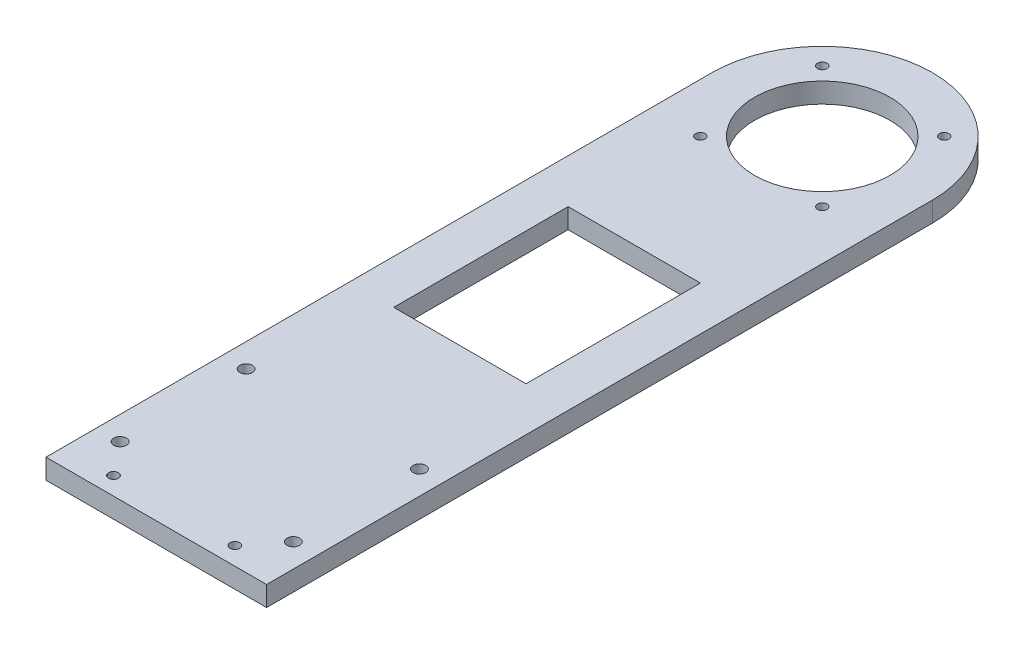
ISO-10303-21;
HEADER;
FILE_DESCRIPTION(('STEP AP214'),'2;1');
FILE_NAME('part.step','',(''),(''),'','','');
FILE_SCHEMA(('AUTOMOTIVE_DESIGN { 1 0 10303 214 1 1 1 1 }'));
ENDSEC;
DATA;
#1=APPLICATION_CONTEXT('core data for automotive mechanical design processes');
#2=APPLICATION_PROTOCOL_DEFINITION('international standard','automotive_design',2000,#1);
#3=PRODUCT_CONTEXT('',#1,'mechanical');
#4=PRODUCT('Part','Part','',(#3));
#5=PRODUCT_RELATED_PRODUCT_CATEGORY('part','',(#4));
#6=PRODUCT_DEFINITION_FORMATION('','',#4);
#7=PRODUCT_DEFINITION_CONTEXT('part definition',#1,'design');
#8=PRODUCT_DEFINITION('design','',#6,#7);
#9=PRODUCT_DEFINITION_SHAPE('','',#8);
#10=(LENGTH_UNIT() NAMED_UNIT(*) SI_UNIT(.MILLI.,.METRE.));
#11=(NAMED_UNIT(*) PLANE_ANGLE_UNIT() SI_UNIT($,.RADIAN.));
#12=(NAMED_UNIT(*) SI_UNIT($,.STERADIAN.) SOLID_ANGLE_UNIT());
#13=UNCERTAINTY_MEASURE_WITH_UNIT(LENGTH_MEASURE(1.E-05),#10,'distance_accuracy_value','');
#14=(GEOMETRIC_REPRESENTATION_CONTEXT(3) GLOBAL_UNCERTAINTY_ASSIGNED_CONTEXT((#13)) GLOBAL_UNIT_ASSIGNED_CONTEXT((#10,
#11,#12)) REPRESENTATION_CONTEXT('',''));
#15=CARTESIAN_POINT('',(0.,0.,0.));
#16=DIRECTION('',(0.,0.,1.));
#17=DIRECTION('',(1.,0.,0.));
#18=AXIS2_PLACEMENT_3D('',#15,#16,#17);
#19=CARTESIAN_POINT('',(0.,3.175,0.));
#20=DIRECTION('',(0.,1.,0.));
#21=DIRECTION('',(0.,0.,1.));
#22=AXIS2_PLACEMENT_3D('',#19,#20,#21);
#23=PLANE('',#22);
#24=CARTESIAN_POINT('',(-19.25,3.175,205.675));
#25=DIRECTION('',(0.,1.,0.));
#26=DIRECTION('',(0.,0.,1.));
#27=AXIS2_PLACEMENT_3D('',#24,#25,#26);
#28=CIRCLE('',#27,1.55);
#29=CARTESIAN_POINT('',(-19.25,3.175,207.225));
#30=VERTEX_POINT('',#29);
#31=EDGE_CURVE('E174',#30,#30,#28,.T.);
#32=ORIENTED_EDGE('',*,*,#31,.F.);
#33=EDGE_LOOP('',(#32));
#34=FACE_BOUND('',#33,.T.);
#35=CARTESIAN_POINT('',(19.25,3.175,205.675));
#36=DIRECTION('',(0.,1.,0.));
#37=DIRECTION('',(0.,0.,1.));
#38=AXIS2_PLACEMENT_3D('',#35,#36,#37);
#39=CIRCLE('',#38,1.55);
#40=CARTESIAN_POINT('',(19.25,3.175,207.225));
#41=VERTEX_POINT('',#40);
#42=EDGE_CURVE('E180',#41,#41,#39,.T.);
#43=ORIENTED_EDGE('',*,*,#42,.F.);
#44=EDGE_LOOP('',(#43));
#45=FACE_BOUND('',#44,.T.);
#46=CARTESIAN_POINT('',(27.5,3.175,155.350000000001));
#47=DIRECTION('',(0.,1.,0.));
#48=DIRECTION('',(0.,0.,-1.));
#49=AXIS2_PLACEMENT_3D('',#46,#47,#48);
#50=CIRCLE('',#49,2.00000000000001);
#51=CARTESIAN_POINT('',(27.5,3.175,153.350000000001));
#52=VERTEX_POINT('',#51);
#53=EDGE_CURVE('E190',#52,#52,#50,.T.);
#54=ORIENTED_EDGE('',*,*,#53,.F.);
#55=EDGE_LOOP('',(#54));
#56=FACE_BOUND('',#55,.T.);
#57=CARTESIAN_POINT('',(-27.5,3.175,195.350000000001));
#58=DIRECTION('',(0.,1.,0.));
#59=DIRECTION('',(0.,0.,1.));
#60=AXIS2_PLACEMENT_3D('',#57,#58,#59);
#61=CIRCLE('',#60,2.00000000000001);
#62=CARTESIAN_POINT('',(-27.5,3.175,197.350000000001));
#63=VERTEX_POINT('',#62);
#64=EDGE_CURVE('E197',#63,#63,#61,.T.);
#65=ORIENTED_EDGE('',*,*,#64,.F.);
#66=EDGE_LOOP('',(#65));
#67=FACE_BOUND('',#66,.T.);
#68=CARTESIAN_POINT('',(27.5,3.175,195.350000000001));
#69=DIRECTION('',(0.,1.,0.));
#70=DIRECTION('',(0.,0.,1.));
#71=AXIS2_PLACEMENT_3D('',#68,#69,#70);
#72=CIRCLE('',#71,2.00000000000001);
#73=CARTESIAN_POINT('',(27.5,3.175,197.350000000001));
#74=VERTEX_POINT('',#73);
#75=EDGE_CURVE('E196',#74,#74,#72,.T.);
#76=ORIENTED_EDGE('',*,*,#75,.F.);
#77=EDGE_LOOP('',(#76));
#78=FACE_BOUND('',#77,.T.);
#79=CARTESIAN_POINT('',(-27.5,3.175,155.350000000001));
#80=DIRECTION('',(0.,1.,0.));
#81=DIRECTION('',(0.,0.,-1.));
#82=AXIS2_PLACEMENT_3D('',#79,#80,#81);
#83=CIRCLE('',#82,2.00000000000001);
#84=CARTESIAN_POINT('',(-27.5,3.175,153.350000000001));
#85=VERTEX_POINT('',#84);
#86=EDGE_CURVE('E178',#85,#85,#83,.T.);
#87=ORIENTED_EDGE('',*,*,#86,.F.);
#88=EDGE_LOOP('',(#87));
#89=FACE_BOUND('',#88,.T.);
#90=CARTESIAN_POINT('',(-19.35,3.175,-19.35));
#91=DIRECTION('',(0.,-1.,0.));
#92=DIRECTION('',(0.,0.,-1.));
#93=AXIS2_PLACEMENT_3D('',#90,#91,#92);
#94=CIRCLE('',#93,1.5);
#95=CARTESIAN_POINT('',(-19.35,3.175,-20.85));
#96=VERTEX_POINT('',#95);
#97=EDGE_CURVE('E223',#96,#96,#94,.T.);
#98=ORIENTED_EDGE('',*,*,#97,.T.);
#99=EDGE_LOOP('',(#98));
#100=FACE_BOUND('',#99,.T.);
#101=CARTESIAN_POINT('',(19.35,3.175,-19.35));
#102=DIRECTION('',(0.,-1.,0.));
#103=DIRECTION('',(0.,0.,-1.));
#104=AXIS2_PLACEMENT_3D('',#101,#102,#103);
#105=CIRCLE('',#104,1.5);
#106=CARTESIAN_POINT('',(19.35,3.175,-20.85));
#107=VERTEX_POINT('',#106);
#108=EDGE_CURVE('E217',#107,#107,#105,.T.);
#109=ORIENTED_EDGE('',*,*,#108,.T.);
#110=EDGE_LOOP('',(#109));
#111=FACE_BOUND('',#110,.T.);
#112=CARTESIAN_POINT('',(19.35,3.175,19.35));
#113=DIRECTION('',(0.,-1.,0.));
#114=DIRECTION('',(0.,0.,-1.));
#115=AXIS2_PLACEMENT_3D('',#112,#113,#114);
#116=CIRCLE('',#115,1.5);
#117=CARTESIAN_POINT('',(19.35,3.175,17.85));
#118=VERTEX_POINT('',#117);
#119=EDGE_CURVE('E211',#118,#118,#116,.T.);
#120=ORIENTED_EDGE('',*,*,#119,.T.);
#121=EDGE_LOOP('',(#120));
#122=FACE_BOUND('',#121,.T.);
#123=CARTESIAN_POINT('',(-19.35,3.175,19.35));
#124=DIRECTION('',(0.,-1.,0.));
#125=DIRECTION('',(0.,0.,-1.));
#126=AXIS2_PLACEMENT_3D('',#123,#124,#125);
#127=CIRCLE('',#126,1.5);
#128=CARTESIAN_POINT('',(-19.35,3.175,17.85));
#129=VERTEX_POINT('',#128);
#130=EDGE_CURVE('E132',#129,#129,#127,.T.);
#131=ORIENTED_EDGE('',*,*,#130,.T.);
#132=EDGE_LOOP('',(#131));
#133=FACE_BOUND('',#132,.T.);
#134=CARTESIAN_POINT('',(0.,3.175,0.));
#135=DIRECTION('',(0.,1.,0.));
#136=DIRECTION('',(0.,0.,1.));
#137=AXIS2_PLACEMENT_3D('',#134,#135,#136);
#138=CIRCLE('',#137,21.5);
#139=CARTESIAN_POINT('',(0.,3.175,21.5));
#140=VERTEX_POINT('',#139);
#141=EDGE_CURVE('E138',#140,#140,#138,.T.);
#142=ORIENTED_EDGE('',*,*,#141,.F.);
#143=EDGE_LOOP('',(#142));
#144=FACE_BOUND('',#143,.T.);
#145=CARTESIAN_POINT('',(0.,3.175,0.));
#146=DIRECTION('',(0.,1.,0.));
#147=DIRECTION('',(0.,0.,1.));
#148=AXIS2_PLACEMENT_3D('',#145,#146,#147);
#149=CIRCLE('',#148,35.);
#150=CARTESIAN_POINT('',(35.,3.175,0.));
#151=VERTEX_POINT('',#150);
#152=CARTESIAN_POINT('',(-35.,3.175,0.));
#153=VERTEX_POINT('',#152);
#154=EDGE_CURVE('E148',#151,#153,#149,.T.);
#155=ORIENTED_EDGE('',*,*,#154,.T.);
#156=DIRECTION('',(0.,0.,1.));
#157=VECTOR('',#156,1.);
#158=CARTESIAN_POINT('',(-35.,3.175,0.));
#159=LINE('',#158,#157);
#160=CARTESIAN_POINT('',(-35.,3.175,211.35));
#161=VERTEX_POINT('',#160);
#162=EDGE_CURVE('E151',#153,#161,#159,.T.);
#163=ORIENTED_EDGE('',*,*,#162,.T.);
#164=DIRECTION('',(1.,0.,0.));
#165=VECTOR('',#164,1.);
#166=CARTESIAN_POINT('',(0.,3.175,211.35));
#167=LINE('',#166,#165);
#168=CARTESIAN_POINT('',(35.,3.175,211.35));
#169=VERTEX_POINT('',#168);
#170=EDGE_CURVE('E154',#161,#169,#167,.T.);
#171=ORIENTED_EDGE('',*,*,#170,.T.);
#172=DIRECTION('',(0.,0.,-1.));
#173=VECTOR('',#172,1.);
#174=CARTESIAN_POINT('',(35.,3.175,0.));
#175=LINE('',#174,#173);
#176=EDGE_CURVE('E156',#169,#151,#175,.T.);
#177=ORIENTED_EDGE('',*,*,#176,.T.);
#178=EDGE_LOOP('',(#155,#163,#171,#177));
#179=FACE_BOUND('',#178,.T.);
#180=DIRECTION('',(-1.,0.,0.));
#181=VECTOR('',#180,1.);
#182=CARTESIAN_POINT('',(0.,3.175,115.));
#183=LINE('',#182,#181);
#184=CARTESIAN_POINT('',(21.,3.175,115.));
#185=VERTEX_POINT('',#184);
#186=CARTESIAN_POINT('',(-21.,3.175,115.));
#187=VERTEX_POINT('',#186);
#188=EDGE_CURVE('E131',#185,#187,#183,.T.);
#189=ORIENTED_EDGE('',*,*,#188,.T.);
#190=DIRECTION('',(0.,0.,-1.));
#191=VECTOR('',#190,1.);
#192=CARTESIAN_POINT('',(-21.,3.175,0.));
#193=LINE('',#192,#191);
#194=CARTESIAN_POINT('',(-21.,3.175,59.65));
#195=VERTEX_POINT('',#194);
#196=EDGE_CURVE('E52',#187,#195,#193,.T.);
#197=ORIENTED_EDGE('',*,*,#196,.T.);
#198=DIRECTION('',(-1.,0.,0.));
#199=VECTOR('',#198,1.);
#200=CARTESIAN_POINT('',(0.,3.175,59.65));
#201=LINE('',#200,#199);
#202=CARTESIAN_POINT('',(21.,3.175,59.65));
#203=VERTEX_POINT('',#202);
#204=EDGE_CURVE('E119',#203,#195,#201,.T.);
#205=ORIENTED_EDGE('',*,*,#204,.F.);
#206=DIRECTION('',(0.,0.,-1.));
#207=VECTOR('',#206,1.);
#208=CARTESIAN_POINT('',(21.,3.175,0.));
#209=LINE('',#208,#207);
#210=EDGE_CURVE('E122',#185,#203,#209,.T.);
#211=ORIENTED_EDGE('',*,*,#210,.F.);
#212=EDGE_LOOP('',(#189,#197,#205,#211));
#213=FACE_BOUND('',#212,.T.);
#214=ADVANCED_FACE('F35',(#34,#45,#56,#67,#78,#89,#100,#111,#122,#133,#144,#179,#213),#23,.T.);
#215=CARTESIAN_POINT('',(0.,-3.175,0.));
#216=DIRECTION('',(0.,1.,0.));
#217=DIRECTION('',(0.,0.,1.));
#218=AXIS2_PLACEMENT_3D('',#215,#216,#217);
#219=PLANE('',#218);
#220=CARTESIAN_POINT('',(-19.25,-3.175,205.675));
#221=DIRECTION('',(0.,1.,0.));
#222=DIRECTION('',(0.,0.,1.));
#223=AXIS2_PLACEMENT_3D('',#220,#221,#222);
#224=CIRCLE('',#223,1.55);
#225=CARTESIAN_POINT('',(-19.25,-3.175,207.225));
#226=VERTEX_POINT('',#225);
#227=EDGE_CURVE('E39',#226,#226,#224,.T.);
#228=ORIENTED_EDGE('',*,*,#227,.T.);
#229=EDGE_LOOP('',(#228));
#230=FACE_BOUND('',#229,.T.);
#231=CARTESIAN_POINT('',(19.25,-3.175,205.675));
#232=DIRECTION('',(0.,1.,0.));
#233=DIRECTION('',(0.,0.,1.));
#234=AXIS2_PLACEMENT_3D('',#231,#232,#233);
#235=CIRCLE('',#234,1.55);
#236=CARTESIAN_POINT('',(19.25,-3.175,207.225));
#237=VERTEX_POINT('',#236);
#238=EDGE_CURVE('E172',#237,#237,#235,.T.);
#239=ORIENTED_EDGE('',*,*,#238,.T.);
#240=EDGE_LOOP('',(#239));
#241=FACE_BOUND('',#240,.T.);
#242=CARTESIAN_POINT('',(27.5,-3.175,155.350000000001));
#243=DIRECTION('',(0.,1.,0.));
#244=DIRECTION('',(0.,0.,-1.));
#245=AXIS2_PLACEMENT_3D('',#242,#243,#244);
#246=CIRCLE('',#245,2.00000000000001);
#247=CARTESIAN_POINT('',(27.5,-3.175,153.350000000001));
#248=VERTEX_POINT('',#247);
#249=EDGE_CURVE('E200',#248,#248,#246,.T.);
#250=ORIENTED_EDGE('',*,*,#249,.T.);
#251=EDGE_LOOP('',(#250));
#252=FACE_BOUND('',#251,.T.);
#253=CARTESIAN_POINT('',(-27.5,-3.175,195.350000000001));
#254=DIRECTION('',(0.,1.,0.));
#255=DIRECTION('',(0.,0.,1.));
#256=AXIS2_PLACEMENT_3D('',#253,#254,#255);
#257=CIRCLE('',#256,2.00000000000001);
#258=CARTESIAN_POINT('',(-27.5,-3.175,197.350000000001));
#259=VERTEX_POINT('',#258);
#260=EDGE_CURVE('E193',#259,#259,#257,.T.);
#261=ORIENTED_EDGE('',*,*,#260,.T.);
#262=EDGE_LOOP('',(#261));
#263=FACE_BOUND('',#262,.T.);
#264=CARTESIAN_POINT('',(27.5,-3.175,195.350000000001));
#265=DIRECTION('',(0.,1.,0.));
#266=DIRECTION('',(0.,0.,1.));
#267=AXIS2_PLACEMENT_3D('',#264,#265,#266);
#268=CIRCLE('',#267,2.00000000000001);
#269=CARTESIAN_POINT('',(27.5,-3.175,197.350000000001));
#270=VERTEX_POINT('',#269);
#271=EDGE_CURVE('E205',#270,#270,#268,.T.);
#272=ORIENTED_EDGE('',*,*,#271,.T.);
#273=EDGE_LOOP('',(#272));
#274=FACE_BOUND('',#273,.T.);
#275=CARTESIAN_POINT('',(-27.5,-3.175,155.350000000001));
#276=DIRECTION('',(0.,1.,0.));
#277=DIRECTION('',(0.,0.,-1.));
#278=AXIS2_PLACEMENT_3D('',#275,#276,#277);
#279=CIRCLE('',#278,2.00000000000001);
#280=CARTESIAN_POINT('',(-27.5,-3.175,153.350000000001));
#281=VERTEX_POINT('',#280);
#282=EDGE_CURVE('E187',#281,#281,#279,.T.);
#283=ORIENTED_EDGE('',*,*,#282,.T.);
#284=EDGE_LOOP('',(#283));
#285=FACE_BOUND('',#284,.T.);
#286=CARTESIAN_POINT('',(-19.35,-3.175,-19.35));
#287=DIRECTION('',(0.,-1.,0.));
#288=DIRECTION('',(0.,0.,-1.));
#289=AXIS2_PLACEMENT_3D('',#286,#287,#288);
#290=CIRCLE('',#289,1.5);
#291=CARTESIAN_POINT('',(-19.35,-3.175,-20.85));
#292=VERTEX_POINT('',#291);
#293=EDGE_CURVE('E208',#292,#292,#290,.T.);
#294=ORIENTED_EDGE('',*,*,#293,.F.);
#295=EDGE_LOOP('',(#294));
#296=FACE_BOUND('',#295,.T.);
#297=CARTESIAN_POINT('',(19.35,-3.175,-19.35));
#298=DIRECTION('',(0.,-1.,0.));
#299=DIRECTION('',(0.,0.,-1.));
#300=AXIS2_PLACEMENT_3D('',#297,#298,#299);
#301=CIRCLE('',#300,1.5);
#302=CARTESIAN_POINT('',(19.35,-3.175,-20.85));
#303=VERTEX_POINT('',#302);
#304=EDGE_CURVE('E220',#303,#303,#301,.T.);
#305=ORIENTED_EDGE('',*,*,#304,.F.);
#306=EDGE_LOOP('',(#305));
#307=FACE_BOUND('',#306,.T.);
#308=CARTESIAN_POINT('',(19.35,-3.175,19.35));
#309=DIRECTION('',(0.,-1.,0.));
#310=DIRECTION('',(0.,0.,-1.));
#311=AXIS2_PLACEMENT_3D('',#308,#309,#310);
#312=CIRCLE('',#311,1.5);
#313=CARTESIAN_POINT('',(19.35,-3.175,17.85));
#314=VERTEX_POINT('',#313);
#315=EDGE_CURVE('E214',#314,#314,#312,.T.);
#316=ORIENTED_EDGE('',*,*,#315,.F.);
#317=EDGE_LOOP('',(#316));
#318=FACE_BOUND('',#317,.T.);
#319=CARTESIAN_POINT('',(-19.35,-3.175,19.35));
#320=DIRECTION('',(0.,-1.,0.));
#321=DIRECTION('',(0.,0.,-1.));
#322=AXIS2_PLACEMENT_3D('',#319,#320,#321);
#323=CIRCLE('',#322,1.5);
#324=CARTESIAN_POINT('',(-19.35,-3.175,17.85));
#325=VERTEX_POINT('',#324);
#326=EDGE_CURVE('E125',#325,#325,#323,.T.);
#327=ORIENTED_EDGE('',*,*,#326,.F.);
#328=EDGE_LOOP('',(#327));
#329=FACE_BOUND('',#328,.T.);
#330=CARTESIAN_POINT('',(0.,-3.175,0.));
#331=DIRECTION('',(0.,1.,0.));
#332=DIRECTION('',(0.,0.,1.));
#333=AXIS2_PLACEMENT_3D('',#330,#331,#332);
#334=CIRCLE('',#333,35.);
#335=CARTESIAN_POINT('',(35.,-3.175,0.));
#336=VERTEX_POINT('',#335);
#337=CARTESIAN_POINT('',(-35.,-3.175,0.));
#338=VERTEX_POINT('',#337);
#339=EDGE_CURVE('E145',#336,#338,#334,.T.);
#340=ORIENTED_EDGE('',*,*,#339,.F.);
#341=DIRECTION('',(0.,0.,-1.));
#342=VECTOR('',#341,1.);
#343=CARTESIAN_POINT('',(35.,-3.175,0.));
#344=LINE('',#343,#342);
#345=CARTESIAN_POINT('',(35.,-3.175,211.35));
#346=VERTEX_POINT('',#345);
#347=EDGE_CURVE('E152',#346,#336,#344,.T.);
#348=ORIENTED_EDGE('',*,*,#347,.F.);
#349=DIRECTION('',(1.,0.,0.));
#350=VECTOR('',#349,1.);
#351=CARTESIAN_POINT('',(0.,-3.175,211.35));
#352=LINE('',#351,#350);
#353=CARTESIAN_POINT('',(-35.,-3.175,211.35));
#354=VERTEX_POINT('',#353);
#355=EDGE_CURVE('E163',#354,#346,#352,.T.);
#356=ORIENTED_EDGE('',*,*,#355,.F.);
#357=DIRECTION('',(0.,0.,1.));
#358=VECTOR('',#357,1.);
#359=CARTESIAN_POINT('',(-35.,-3.175,0.));
#360=LINE('',#359,#358);
#361=EDGE_CURVE('E161',#338,#354,#360,.T.);
#362=ORIENTED_EDGE('',*,*,#361,.F.);
#363=EDGE_LOOP('',(#340,#348,#356,#362));
#364=FACE_BOUND('',#363,.T.);
#365=CARTESIAN_POINT('',(0.,-3.175,0.));
#366=DIRECTION('',(0.,1.,0.));
#367=DIRECTION('',(0.,0.,1.));
#368=AXIS2_PLACEMENT_3D('',#365,#366,#367);
#369=CIRCLE('',#368,21.5);
#370=CARTESIAN_POINT('',(0.,-3.175,21.5));
#371=VERTEX_POINT('',#370);
#372=EDGE_CURVE('E142',#371,#371,#369,.T.);
#373=ORIENTED_EDGE('',*,*,#372,.T.);
#374=EDGE_LOOP('',(#373));
#375=FACE_BOUND('',#374,.T.);
#376=DIRECTION('',(0.,0.,-1.));
#377=VECTOR('',#376,1.);
#378=CARTESIAN_POINT('',(-21.,-3.175,0.));
#379=LINE('',#378,#377);
#380=CARTESIAN_POINT('',(-21.,-3.175,115.));
#381=VERTEX_POINT('',#380);
#382=CARTESIAN_POINT('',(-21.,-3.175,59.65));
#383=VERTEX_POINT('',#382);
#384=EDGE_CURVE('E110',#381,#383,#379,.T.);
#385=ORIENTED_EDGE('',*,*,#384,.F.);
#386=DIRECTION('',(-1.,0.,0.));
#387=VECTOR('',#386,1.);
#388=CARTESIAN_POINT('',(0.,-3.175,115.));
#389=LINE('',#388,#387);
#390=CARTESIAN_POINT('',(21.,-3.175,115.));
#391=VERTEX_POINT('',#390);
#392=EDGE_CURVE('E102',#391,#381,#389,.T.);
#393=ORIENTED_EDGE('',*,*,#392,.F.);
#394=DIRECTION('',(0.,0.,-1.));
#395=VECTOR('',#394,1.);
#396=CARTESIAN_POINT('',(21.,-3.175,0.));
#397=LINE('',#396,#395);
#398=CARTESIAN_POINT('',(21.,-3.175,59.65));
#399=VERTEX_POINT('',#398);
#400=EDGE_CURVE('E60',#391,#399,#397,.T.);
#401=ORIENTED_EDGE('',*,*,#400,.T.);
#402=DIRECTION('',(-1.,0.,0.));
#403=VECTOR('',#402,1.);
#404=CARTESIAN_POINT('',(0.,-3.175,59.65));
#405=LINE('',#404,#403);
#406=EDGE_CURVE('E114',#399,#383,#405,.T.);
#407=ORIENTED_EDGE('',*,*,#406,.T.);
#408=EDGE_LOOP('',(#385,#393,#401,#407));
#409=FACE_BOUND('',#408,.T.);
#410=ADVANCED_FACE('F117',(#230,#241,#252,#263,#274,#285,#296,#307,#318,#329,#364,#375,#409),
#219,.F.);
#411=CARTESIAN_POINT('',(0.,3.175,0.));
#412=DIRECTION('',(0.,-1.,0.));
#413=DIRECTION('',(0.,0.,-1.));
#414=AXIS2_PLACEMENT_3D('',#411,#412,#413);
#415=CYLINDRICAL_SURFACE('',#414,35.);
#416=ORIENTED_EDGE('',*,*,#339,.T.);
#417=DIRECTION('',(0.,-1.,0.));
#418=VECTOR('',#417,1.);
#419=CARTESIAN_POINT('',(-35.,3.175,0.));
#420=LINE('',#419,#418);
#421=EDGE_CURVE('E11',#153,#338,#420,.T.);
#422=ORIENTED_EDGE('',*,*,#421,.F.);
#423=ORIENTED_EDGE('',*,*,#154,.F.);
#424=DIRECTION('',(0.,-1.,0.));
#425=VECTOR('',#424,1.);
#426=CARTESIAN_POINT('',(35.,3.175,0.));
#427=LINE('',#426,#425);
#428=EDGE_CURVE('E158',#151,#336,#427,.T.);
#429=ORIENTED_EDGE('',*,*,#428,.T.);
#430=EDGE_LOOP('',(#416,#422,#423,#429));
#431=FACE_BOUND('',#430,.T.);
#432=ADVANCED_FACE('F37',(#431),#415,.T.);
#433=CARTESIAN_POINT('',(-35.,3.175,0.));
#434=DIRECTION('',(1.,0.,0.));
#435=DIRECTION('',(0.,0.,-1.));
#436=AXIS2_PLACEMENT_3D('',#433,#434,#435);
#437=PLANE('',#436);
#438=ORIENTED_EDGE('',*,*,#361,.T.);
#439=DIRECTION('',(0.,-1.,0.));
#440=VECTOR('',#439,1.);
#441=CARTESIAN_POINT('',(-35.,3.175,211.35));
#442=LINE('',#441,#440);
#443=EDGE_CURVE('E44',#161,#354,#442,.T.);
#444=ORIENTED_EDGE('',*,*,#443,.F.);
#445=ORIENTED_EDGE('',*,*,#162,.F.);
#446=ORIENTED_EDGE('',*,*,#421,.T.);
#447=EDGE_LOOP('',(#438,#444,#445,#446));
#448=FACE_BOUND('',#447,.T.);
#449=ADVANCED_FACE('F281',(#448),#437,.F.);
#450=CARTESIAN_POINT('',(0.,3.175,211.35));
#451=DIRECTION('',(0.,0.,-1.));
#452=DIRECTION('',(-1.,0.,0.));
#453=AXIS2_PLACEMENT_3D('',#450,#451,#452);
#454=PLANE('',#453);
#455=ORIENTED_EDGE('',*,*,#355,.T.);
#456=DIRECTION('',(0.,-1.,0.));
#457=VECTOR('',#456,1.);
#458=CARTESIAN_POINT('',(35.,3.175,211.35));
#459=LINE('',#458,#457);
#460=EDGE_CURVE('E168',#169,#346,#459,.T.);
#461=ORIENTED_EDGE('',*,*,#460,.F.);
#462=ORIENTED_EDGE('',*,*,#170,.F.);
#463=ORIENTED_EDGE('',*,*,#443,.T.);
#464=EDGE_LOOP('',(#455,#461,#462,#463));
#465=FACE_BOUND('',#464,.T.);
#466=ADVANCED_FACE('F278',(#465),#454,.F.);
#467=CARTESIAN_POINT('',(35.,3.175,0.));
#468=DIRECTION('',(-1.,0.,0.));
#469=DIRECTION('',(0.,0.,1.));
#470=AXIS2_PLACEMENT_3D('',#467,#468,#469);
#471=PLANE('',#470);
#472=ORIENTED_EDGE('',*,*,#347,.T.);
#473=ORIENTED_EDGE('',*,*,#428,.F.);
#474=ORIENTED_EDGE('',*,*,#176,.F.);
#475=ORIENTED_EDGE('',*,*,#460,.T.);
#476=EDGE_LOOP('',(#472,#473,#474,#475));
#477=FACE_BOUND('',#476,.T.);
#478=ADVANCED_FACE('F247',(#477),#471,.F.);
#479=CARTESIAN_POINT('',(0.,-3.175,0.));
#480=DIRECTION('',(0.,1.,0.));
#481=DIRECTION('',(0.,0.,1.));
#482=AXIS2_PLACEMENT_3D('',#479,#480,#481);
#483=CYLINDRICAL_SURFACE('',#482,21.5);
#484=ORIENTED_EDGE('',*,*,#372,.F.);
#485=EDGE_LOOP('',(#484));
#486=FACE_BOUND('',#485,.T.);
#487=ORIENTED_EDGE('',*,*,#141,.T.);
#488=EDGE_LOOP('',(#487));
#489=FACE_BOUND('',#488,.T.);
#490=ADVANCED_FACE('F244',(#486,#489),#483,.F.);
#491=CARTESIAN_POINT('',(-21.,-3.175,0.));
#492=DIRECTION('',(1.,0.,0.));
#493=DIRECTION('',(0.,0.,-1.));
#494=AXIS2_PLACEMENT_3D('',#491,#492,#493);
#495=PLANE('',#494);
#496=ORIENTED_EDGE('',*,*,#196,.F.);
#497=DIRECTION('',(0.,1.,0.));
#498=VECTOR('',#497,1.);
#499=CARTESIAN_POINT('',(-21.,-3.175,115.));
#500=LINE('',#499,#498);
#501=EDGE_CURVE('E105',#381,#187,#500,.T.);
#502=ORIENTED_EDGE('',*,*,#501,.F.);
#503=ORIENTED_EDGE('',*,*,#384,.T.);
#504=DIRECTION('',(0.,1.,0.));
#505=VECTOR('',#504,1.);
#506=CARTESIAN_POINT('',(-21.,-3.175,59.65));
#507=LINE('',#506,#505);
#508=EDGE_CURVE('E136',#383,#195,#507,.T.);
#509=ORIENTED_EDGE('',*,*,#508,.T.);
#510=EDGE_LOOP('',(#496,#502,#503,#509));
#511=FACE_BOUND('',#510,.T.);
#512=ADVANCED_FACE('F112',(#511),#495,.T.);
#513=CARTESIAN_POINT('',(0.,-3.175,59.65));
#514=DIRECTION('',(0.,0.,-1.));
#515=DIRECTION('',(-1.,0.,0.));
#516=AXIS2_PLACEMENT_3D('',#513,#514,#515);
#517=PLANE('',#516);
#518=ORIENTED_EDGE('',*,*,#204,.T.);
#519=ORIENTED_EDGE('',*,*,#508,.F.);
#520=ORIENTED_EDGE('',*,*,#406,.F.);
#521=DIRECTION('',(0.,1.,0.));
#522=VECTOR('',#521,1.);
#523=CARTESIAN_POINT('',(21.,-3.175,59.65));
#524=LINE('',#523,#522);
#525=EDGE_CURVE('E139',#399,#203,#524,.T.);
#526=ORIENTED_EDGE('',*,*,#525,.T.);
#527=EDGE_LOOP('',(#518,#519,#520,#526));
#528=FACE_BOUND('',#527,.T.);
#529=ADVANCED_FACE('F262',(#528),#517,.F.);
#530=CARTESIAN_POINT('',(21.,-3.175,0.));
#531=DIRECTION('',(1.,0.,0.));
#532=DIRECTION('',(0.,0.,-1.));
#533=AXIS2_PLACEMENT_3D('',#530,#531,#532);
#534=PLANE('',#533);
#535=ORIENTED_EDGE('',*,*,#210,.T.);
#536=ORIENTED_EDGE('',*,*,#525,.F.);
#537=ORIENTED_EDGE('',*,*,#400,.F.);
#538=DIRECTION('',(0.,1.,0.));
#539=VECTOR('',#538,1.);
#540=CARTESIAN_POINT('',(21.,-3.175,115.));
#541=LINE('',#540,#539);
#542=EDGE_CURVE('E107',#391,#185,#541,.T.);
#543=ORIENTED_EDGE('',*,*,#542,.T.);
#544=EDGE_LOOP('',(#535,#536,#537,#543));
#545=FACE_BOUND('',#544,.T.);
#546=ADVANCED_FACE('F260',(#545),#534,.F.);
#547=CARTESIAN_POINT('',(0.,-3.175,115.));
#548=DIRECTION('',(0.,0.,-1.));
#549=DIRECTION('',(-1.,0.,0.));
#550=AXIS2_PLACEMENT_3D('',#547,#548,#549);
#551=PLANE('',#550);
#552=ORIENTED_EDGE('',*,*,#188,.F.);
#553=ORIENTED_EDGE('',*,*,#542,.F.);
#554=ORIENTED_EDGE('',*,*,#392,.T.);
#555=ORIENTED_EDGE('',*,*,#501,.T.);
#556=EDGE_LOOP('',(#552,#553,#554,#555));
#557=FACE_BOUND('',#556,.T.);
#558=ADVANCED_FACE('F104',(#557),#551,.T.);
#559=CARTESIAN_POINT('',(-19.35,3.175,19.35));
#560=DIRECTION('',(0.,-1.,0.));
#561=DIRECTION('',(0.,0.,-1.));
#562=AXIS2_PLACEMENT_3D('',#559,#560,#561);
#563=CYLINDRICAL_SURFACE('',#562,1.5);
#564=ORIENTED_EDGE('',*,*,#130,.F.);
#565=EDGE_LOOP('',(#564));
#566=FACE_BOUND('',#565,.T.);
#567=ORIENTED_EDGE('',*,*,#326,.T.);
#568=EDGE_LOOP('',(#567));
#569=FACE_BOUND('',#568,.T.);
#570=ADVANCED_FACE('F233',(#566,#569),#563,.F.);
#571=CARTESIAN_POINT('',(19.35,3.175,19.35));
#572=DIRECTION('',(0.,-1.,0.));
#573=DIRECTION('',(0.,0.,-1.));
#574=AXIS2_PLACEMENT_3D('',#571,#572,#573);
#575=CYLINDRICAL_SURFACE('',#574,1.5);
#576=ORIENTED_EDGE('',*,*,#119,.F.);
#577=EDGE_LOOP('',(#576));
#578=FACE_BOUND('',#577,.T.);
#579=ORIENTED_EDGE('',*,*,#315,.T.);
#580=EDGE_LOOP('',(#579));
#581=FACE_BOUND('',#580,.T.);
#582=ADVANCED_FACE('F370',(#578,#581),#575,.F.);
#583=CARTESIAN_POINT('',(19.35,3.175,-19.35));
#584=DIRECTION('',(0.,-1.,0.));
#585=DIRECTION('',(0.,0.,-1.));
#586=AXIS2_PLACEMENT_3D('',#583,#584,#585);
#587=CYLINDRICAL_SURFACE('',#586,1.5);
#588=ORIENTED_EDGE('',*,*,#108,.F.);
#589=EDGE_LOOP('',(#588));
#590=FACE_BOUND('',#589,.T.);
#591=ORIENTED_EDGE('',*,*,#304,.T.);
#592=EDGE_LOOP('',(#591));
#593=FACE_BOUND('',#592,.T.);
#594=ADVANCED_FACE('F361',(#590,#593),#587,.F.);
#595=CARTESIAN_POINT('',(-19.35,3.175,-19.35));
#596=DIRECTION('',(0.,-1.,0.));
#597=DIRECTION('',(0.,0.,-1.));
#598=AXIS2_PLACEMENT_3D('',#595,#596,#597);
#599=CYLINDRICAL_SURFACE('',#598,1.5);
#600=ORIENTED_EDGE('',*,*,#97,.F.);
#601=EDGE_LOOP('',(#600));
#602=FACE_BOUND('',#601,.T.);
#603=ORIENTED_EDGE('',*,*,#293,.T.);
#604=EDGE_LOOP('',(#603));
#605=FACE_BOUND('',#604,.T.);
#606=ADVANCED_FACE('F351',(#602,#605),#599,.F.);
#607=CARTESIAN_POINT('',(-27.5,-3.175,155.350000000001));
#608=DIRECTION('',(0.,1.,0.));
#609=DIRECTION('',(0.,0.,1.));
#610=AXIS2_PLACEMENT_3D('',#607,#608,#609);
#611=CYLINDRICAL_SURFACE('',#610,2.00000000000001);
#612=ORIENTED_EDGE('',*,*,#282,.F.);
#613=EDGE_LOOP('',(#612));
#614=FACE_BOUND('',#613,.T.);
#615=ORIENTED_EDGE('',*,*,#86,.T.);
#616=EDGE_LOOP('',(#615));
#617=FACE_BOUND('',#616,.T.);
#618=ADVANCED_FACE('F341',(#614,#617),#611,.F.);
#619=CARTESIAN_POINT('',(27.5,-3.175,195.350000000001));
#620=DIRECTION('',(0.,1.,0.));
#621=DIRECTION('',(0.,0.,1.));
#622=AXIS2_PLACEMENT_3D('',#619,#620,#621);
#623=CYLINDRICAL_SURFACE('',#622,2.00000000000001);
#624=ORIENTED_EDGE('',*,*,#271,.F.);
#625=EDGE_LOOP('',(#624));
#626=FACE_BOUND('',#625,.T.);
#627=ORIENTED_EDGE('',*,*,#75,.T.);
#628=EDGE_LOOP('',(#627));
#629=FACE_BOUND('',#628,.T.);
#630=ADVANCED_FACE('F331',(#626,#629),#623,.F.);
#631=CARTESIAN_POINT('',(-27.5,-3.175,195.350000000001));
#632=DIRECTION('',(0.,1.,0.));
#633=DIRECTION('',(0.,0.,1.));
#634=AXIS2_PLACEMENT_3D('',#631,#632,#633);
#635=CYLINDRICAL_SURFACE('',#634,2.00000000000001);
#636=ORIENTED_EDGE('',*,*,#260,.F.);
#637=EDGE_LOOP('',(#636));
#638=FACE_BOUND('',#637,.T.);
#639=ORIENTED_EDGE('',*,*,#64,.T.);
#640=EDGE_LOOP('',(#639));
#641=FACE_BOUND('',#640,.T.);
#642=ADVANCED_FACE('F319',(#638,#641),#635,.F.);
#643=CARTESIAN_POINT('',(27.5,-3.175,155.350000000001));
#644=DIRECTION('',(0.,1.,0.));
#645=DIRECTION('',(0.,0.,1.));
#646=AXIS2_PLACEMENT_3D('',#643,#644,#645);
#647=CYLINDRICAL_SURFACE('',#646,2.00000000000001);
#648=ORIENTED_EDGE('',*,*,#249,.F.);
#649=EDGE_LOOP('',(#648));
#650=FACE_BOUND('',#649,.T.);
#651=ORIENTED_EDGE('',*,*,#53,.T.);
#652=EDGE_LOOP('',(#651));
#653=FACE_BOUND('',#652,.T.);
#654=ADVANCED_FACE('F313',(#650,#653),#647,.F.);
#655=CARTESIAN_POINT('',(19.25,-6.825,205.675));
#656=DIRECTION('',(0.,1.,0.));
#657=DIRECTION('',(0.,0.,1.));
#658=AXIS2_PLACEMENT_3D('',#655,#656,#657);
#659=CYLINDRICAL_SURFACE('',#658,1.55);
#660=ORIENTED_EDGE('',*,*,#42,.T.);
#661=EDGE_LOOP('',(#660));
#662=FACE_BOUND('',#661,.T.);
#663=ORIENTED_EDGE('',*,*,#238,.F.);
#664=EDGE_LOOP('',(#663));
#665=FACE_BOUND('',#664,.T.);
#666=ADVANCED_FACE('F318',(#662,#665),#659,.F.);
#667=CARTESIAN_POINT('',(-19.25,-6.825,205.675));
#668=DIRECTION('',(0.,1.,0.));
#669=DIRECTION('',(0.,0.,1.));
#670=AXIS2_PLACEMENT_3D('',#667,#668,#669);
#671=CYLINDRICAL_SURFACE('',#670,1.55);
#672=ORIENTED_EDGE('',*,*,#31,.T.);
#673=EDGE_LOOP('',(#672));
#674=FACE_BOUND('',#673,.T.);
#675=ORIENTED_EDGE('',*,*,#227,.F.);
#676=EDGE_LOOP('',(#675));
#677=FACE_BOUND('',#676,.T.);
#678=ADVANCED_FACE('F448',(#674,#677),#671,.F.);
#679=CLOSED_SHELL('',(#214,#410,#432,#449,#466,#478,#490,#512,#529,#546,#558,#570,#582,#594,
#606,#618,#630,#642,#654,#666,#678));
#680=MANIFOLD_SOLID_BREP('B2',#679);
#681=ADVANCED_BREP_SHAPE_REPRESENTATION('',(#18,#680),#14);
#682=SHAPE_DEFINITION_REPRESENTATION(#9,#681);
ENDSEC;
END-ISO-10303-21;
